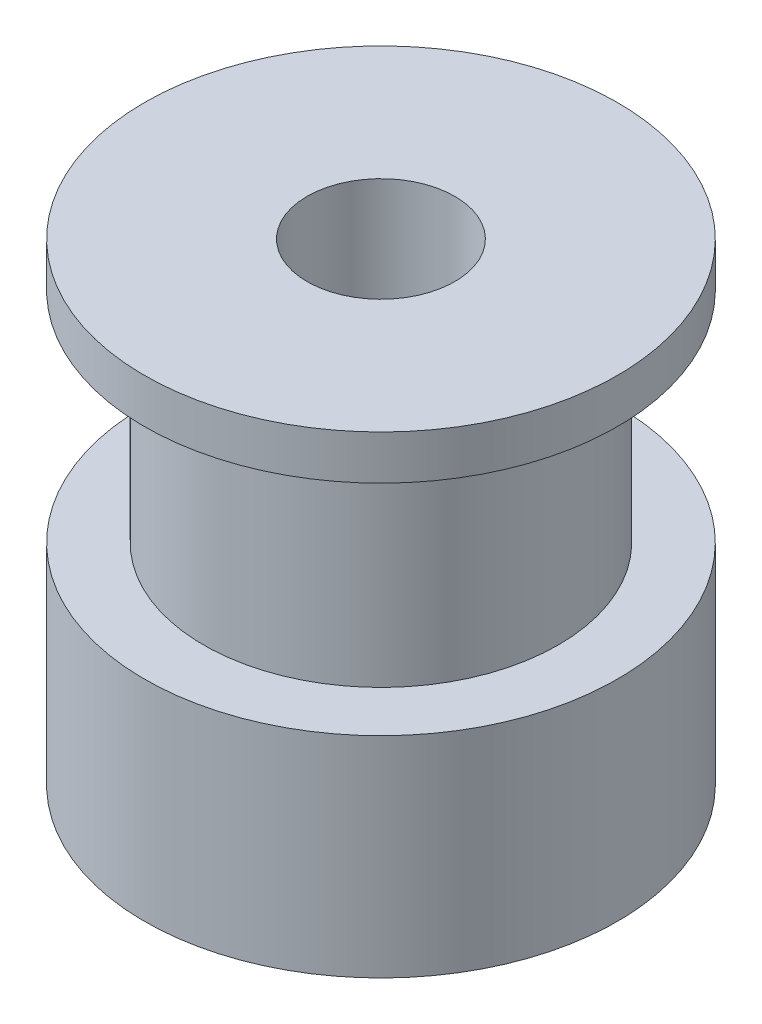
ISO-10303-21;
HEADER;
FILE_DESCRIPTION(('STEP AP214'),'2;1');
FILE_NAME('part.step','',(''),(''),'','','');
FILE_SCHEMA(('AUTOMOTIVE_DESIGN { 1 0 10303 214 1 1 1 1 }'));
ENDSEC;
DATA;
#1=APPLICATION_CONTEXT('core data for automotive mechanical design processes');
#2=APPLICATION_PROTOCOL_DEFINITION('international standard','automotive_design',2000,#1);
#3=PRODUCT_CONTEXT('',#1,'mechanical');
#4=PRODUCT('Part','Part','',(#3));
#5=PRODUCT_RELATED_PRODUCT_CATEGORY('part','',(#4));
#6=PRODUCT_DEFINITION_FORMATION('','',#4);
#7=PRODUCT_DEFINITION_CONTEXT('part definition',#1,'design');
#8=PRODUCT_DEFINITION('design','',#6,#7);
#9=PRODUCT_DEFINITION_SHAPE('','',#8);
#10=(LENGTH_UNIT() NAMED_UNIT(*) SI_UNIT(.MILLI.,.METRE.));
#11=(NAMED_UNIT(*) PLANE_ANGLE_UNIT() SI_UNIT($,.RADIAN.));
#12=(NAMED_UNIT(*) SI_UNIT($,.STERADIAN.) SOLID_ANGLE_UNIT());
#13=UNCERTAINTY_MEASURE_WITH_UNIT(LENGTH_MEASURE(1.E-05),#10,'distance_accuracy_value','');
#14=(GEOMETRIC_REPRESENTATION_CONTEXT(3) GLOBAL_UNCERTAINTY_ASSIGNED_CONTEXT((#13)) GLOBAL_UNIT_ASSIGNED_CONTEXT((#10,
#11,#12)) REPRESENTATION_CONTEXT('',''));
#15=CARTESIAN_POINT('',(0.,0.,0.));
#16=DIRECTION('',(0.,0.,1.));
#17=DIRECTION('',(1.,0.,0.));
#18=AXIS2_PLACEMENT_3D('',#15,#16,#17);
#19=CARTESIAN_POINT('',(0.,0.,0.));
#20=DIRECTION('',(0.,1.,0.));
#21=DIRECTION('',(-1.,0.,0.));
#22=AXIS2_PLACEMENT_3D('',#19,#20,#21);
#23=PLANE('',#22);
#24=CARTESIAN_POINT('',(0.,0.,0.));
#25=DIRECTION('',(0.,1.,0.));
#26=DIRECTION('',(-1.,0.,0.));
#27=AXIS2_PLACEMENT_3D('',#24,#25,#26);
#28=CIRCLE('',#27,2.5);
#29=CARTESIAN_POINT('',(-2.5,0.,0.));
#30=VERTEX_POINT('',#29);
#31=EDGE_CURVE('E55',#30,#30,#28,.F.);
#32=ORIENTED_EDGE('',*,*,#31,.F.);
#33=EDGE_LOOP('',(#32));
#34=FACE_BOUND('',#33,.T.);
#35=CARTESIAN_POINT('',(0.,0.,0.));
#36=DIRECTION('',(0.,1.,0.));
#37=DIRECTION('',(-1.,0.,0.));
#38=AXIS2_PLACEMENT_3D('',#35,#36,#37);
#39=CIRCLE('',#38,8.);
#40=CARTESIAN_POINT('',(-8.,0.,0.));
#41=VERTEX_POINT('',#40);
#42=EDGE_CURVE('E10',#41,#41,#39,.T.);
#43=ORIENTED_EDGE('',*,*,#42,.F.);
#44=EDGE_LOOP('',(#43));
#45=FACE_BOUND('',#44,.T.);
#46=ADVANCED_FACE('F30',(#34,#45),#23,.F.);
#47=CARTESIAN_POINT('',(0.,16.,0.));
#48=DIRECTION('',(0.,1.,0.));
#49=DIRECTION('',(-1.,0.,0.));
#50=AXIS2_PLACEMENT_3D('',#47,#48,#49);
#51=CYLINDRICAL_SURFACE('',#50,8.);
#52=CARTESIAN_POINT('',(0.,7.1,0.));
#53=DIRECTION('',(0.,1.,0.));
#54=DIRECTION('',(-1.,0.,0.));
#55=AXIS2_PLACEMENT_3D('',#52,#53,#54);
#56=CIRCLE('',#55,8.);
#57=CARTESIAN_POINT('',(-8.,7.1,0.));
#58=VERTEX_POINT('',#57);
#59=EDGE_CURVE('E36',#58,#58,#56,.T.);
#60=ORIENTED_EDGE('',*,*,#59,.F.);
#61=EDGE_LOOP('',(#60));
#62=FACE_BOUND('',#61,.T.);
#63=ORIENTED_EDGE('',*,*,#42,.T.);
#64=EDGE_LOOP('',(#63));
#65=FACE_BOUND('',#64,.T.);
#66=ADVANCED_FACE('F91',(#62,#65),#51,.T.);
#67=CARTESIAN_POINT('',(8.,7.1,0.));
#68=DIRECTION('',(0.,-1.,0.));
#69=DIRECTION('',(1.,0.,0.));
#70=AXIS2_PLACEMENT_3D('',#67,#68,#69);
#71=PLANE('',#70);
#72=CARTESIAN_POINT('',(0.,7.1,0.));
#73=DIRECTION('',(0.,1.,0.));
#74=DIRECTION('',(-1.,0.,0.));
#75=AXIS2_PLACEMENT_3D('',#72,#73,#74);
#76=CIRCLE('',#75,6.);
#77=CARTESIAN_POINT('',(-6.,7.1,0.));
#78=VERTEX_POINT('',#77);
#79=EDGE_CURVE('E40',#78,#78,#76,.T.);
#80=ORIENTED_EDGE('',*,*,#79,.F.);
#81=EDGE_LOOP('',(#80));
#82=FACE_BOUND('',#81,.T.);
#83=ORIENTED_EDGE('',*,*,#59,.T.);
#84=EDGE_LOOP('',(#83));
#85=FACE_BOUND('',#84,.T.);
#86=ADVANCED_FACE('F86',(#82,#85),#71,.F.);
#87=CARTESIAN_POINT('',(0.,16.,0.));
#88=DIRECTION('',(0.,1.,0.));
#89=DIRECTION('',(-1.,0.,0.));
#90=AXIS2_PLACEMENT_3D('',#87,#88,#89);
#91=CYLINDRICAL_SURFACE('',#90,6.);
#92=CARTESIAN_POINT('',(0.,14.5,0.));
#93=DIRECTION('',(0.,1.,0.));
#94=DIRECTION('',(-1.,0.,0.));
#95=AXIS2_PLACEMENT_3D('',#92,#93,#94);
#96=CIRCLE('',#95,6.);
#97=CARTESIAN_POINT('',(-6.,14.5,0.));
#98=VERTEX_POINT('',#97);
#99=EDGE_CURVE('E44',#98,#98,#96,.T.);
#100=ORIENTED_EDGE('',*,*,#99,.F.);
#101=EDGE_LOOP('',(#100));
#102=FACE_BOUND('',#101,.T.);
#103=ORIENTED_EDGE('',*,*,#79,.T.);
#104=EDGE_LOOP('',(#103));
#105=FACE_BOUND('',#104,.T.);
#106=ADVANCED_FACE('F80',(#102,#105),#91,.T.);
#107=CARTESIAN_POINT('',(6.,14.5,0.));
#108=DIRECTION('',(0.,1.,0.));
#109=DIRECTION('',(-1.,0.,0.));
#110=AXIS2_PLACEMENT_3D('',#107,#108,#109);
#111=PLANE('',#110);
#112=CARTESIAN_POINT('',(0.,14.5,0.));
#113=DIRECTION('',(0.,1.,0.));
#114=DIRECTION('',(-1.,0.,0.));
#115=AXIS2_PLACEMENT_3D('',#112,#113,#114);
#116=CIRCLE('',#115,8.);
#117=CARTESIAN_POINT('',(-8.,14.5,0.));
#118=VERTEX_POINT('',#117);
#119=EDGE_CURVE('E49',#118,#118,#116,.T.);
#120=ORIENTED_EDGE('',*,*,#119,.F.);
#121=EDGE_LOOP('',(#120));
#122=FACE_BOUND('',#121,.T.);
#123=ORIENTED_EDGE('',*,*,#99,.T.);
#124=EDGE_LOOP('',(#123));
#125=FACE_BOUND('',#124,.T.);
#126=ADVANCED_FACE('F74',(#122,#125),#111,.F.);
#127=CARTESIAN_POINT('',(0.,16.,0.));
#128=DIRECTION('',(0.,1.,0.));
#129=DIRECTION('',(-1.,0.,0.));
#130=AXIS2_PLACEMENT_3D('',#127,#128,#129);
#131=CYLINDRICAL_SURFACE('',#130,8.);
#132=CARTESIAN_POINT('',(0.,16.,0.));
#133=DIRECTION('',(0.,1.,0.));
#134=DIRECTION('',(-1.,0.,0.));
#135=AXIS2_PLACEMENT_3D('',#132,#133,#134);
#136=CIRCLE('',#135,8.);
#137=CARTESIAN_POINT('',(-8.,16.,0.));
#138=VERTEX_POINT('',#137);
#139=EDGE_CURVE('E52',#138,#138,#136,.T.);
#140=ORIENTED_EDGE('',*,*,#139,.F.);
#141=EDGE_LOOP('',(#140));
#142=FACE_BOUND('',#141,.T.);
#143=ORIENTED_EDGE('',*,*,#119,.T.);
#144=EDGE_LOOP('',(#143));
#145=FACE_BOUND('',#144,.T.);
#146=ADVANCED_FACE('F68',(#142,#145),#131,.T.);
#147=CARTESIAN_POINT('',(8.,16.,0.));
#148=DIRECTION('',(0.,-1.,0.));
#149=DIRECTION('',(1.,0.,0.));
#150=AXIS2_PLACEMENT_3D('',#147,#148,#149);
#151=PLANE('',#150);
#152=CARTESIAN_POINT('',(0.,16.,0.));
#153=DIRECTION('',(0.,1.,0.));
#154=DIRECTION('',(-1.,0.,0.));
#155=AXIS2_PLACEMENT_3D('',#152,#153,#154);
#156=CIRCLE('',#155,2.5);
#157=CARTESIAN_POINT('',(-2.5,16.,0.));
#158=VERTEX_POINT('',#157);
#159=EDGE_CURVE('E58',#158,#158,#156,.T.);
#160=ORIENTED_EDGE('',*,*,#159,.F.);
#161=EDGE_LOOP('',(#160));
#162=FACE_BOUND('',#161,.T.);
#163=ORIENTED_EDGE('',*,*,#139,.T.);
#164=EDGE_LOOP('',(#163));
#165=FACE_BOUND('',#164,.T.);
#166=ADVANCED_FACE('F65',(#162,#165),#151,.F.);
#167=CARTESIAN_POINT('',(0.,-0.001000000000001,0.));
#168=DIRECTION('',(0.,1.,0.));
#169=DIRECTION('',(-1.,0.,0.));
#170=AXIS2_PLACEMENT_3D('',#167,#168,#169);
#171=CYLINDRICAL_SURFACE('',#170,2.5);
#172=ORIENTED_EDGE('',*,*,#159,.T.);
#173=EDGE_LOOP('',(#172));
#174=FACE_BOUND('',#173,.T.);
#175=ORIENTED_EDGE('',*,*,#31,.T.);
#176=EDGE_LOOP('',(#175));
#177=FACE_BOUND('',#176,.T.);
#178=ADVANCED_FACE('F62',(#174,#177),#171,.F.);
#179=CLOSED_SHELL('',(#46,#66,#86,#106,#126,#146,#166,#178));
#180=MANIFOLD_SOLID_BREP('B2',#179);
#181=ADVANCED_BREP_SHAPE_REPRESENTATION('',(#18,#180),#14);
#182=SHAPE_DEFINITION_REPRESENTATION(#9,#181);
ENDSEC;
END-ISO-10303-21;
